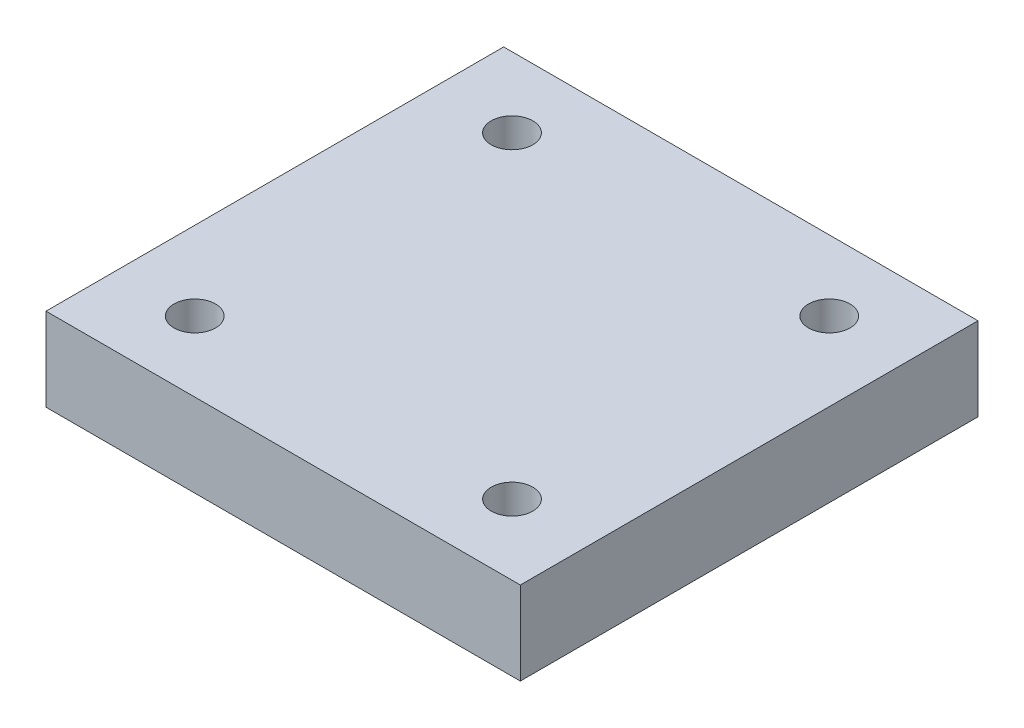
ISO-10303-21;
HEADER;
FILE_DESCRIPTION(('STEP AP214'),'2;1');
FILE_NAME('part.step','',(''),(''),'','','');
FILE_SCHEMA(('AUTOMOTIVE_DESIGN { 1 0 10303 214 1 1 1 1 }'));
ENDSEC;
DATA;
#1=APPLICATION_CONTEXT('core data for automotive mechanical design processes');
#2=APPLICATION_PROTOCOL_DEFINITION('international standard','automotive_design',2000,#1);
#3=PRODUCT_CONTEXT('',#1,'mechanical');
#4=PRODUCT('Part','Part','',(#3));
#5=PRODUCT_RELATED_PRODUCT_CATEGORY('part','',(#4));
#6=PRODUCT_DEFINITION_FORMATION('','',#4);
#7=PRODUCT_DEFINITION_CONTEXT('part definition',#1,'design');
#8=PRODUCT_DEFINITION('design','',#6,#7);
#9=PRODUCT_DEFINITION_SHAPE('','',#8);
#10=(LENGTH_UNIT() NAMED_UNIT(*) SI_UNIT(.MILLI.,.METRE.));
#11=(NAMED_UNIT(*) PLANE_ANGLE_UNIT() SI_UNIT($,.RADIAN.));
#12=(NAMED_UNIT(*) SI_UNIT($,.STERADIAN.) SOLID_ANGLE_UNIT());
#13=UNCERTAINTY_MEASURE_WITH_UNIT(LENGTH_MEASURE(1.E-05),#10,'distance_accuracy_value','');
#14=(GEOMETRIC_REPRESENTATION_CONTEXT(3) GLOBAL_UNCERTAINTY_ASSIGNED_CONTEXT((#13)) GLOBAL_UNIT_ASSIGNED_CONTEXT((#10,
#11,#12)) REPRESENTATION_CONTEXT('',''));
#15=CARTESIAN_POINT('',(0.,0.,0.));
#16=DIRECTION('',(0.,0.,1.));
#17=DIRECTION('',(1.,0.,0.));
#18=AXIS2_PLACEMENT_3D('',#15,#16,#17);
#19=CARTESIAN_POINT('',(0.,8.,0.));
#20=DIRECTION('',(0.,1.,0.));
#21=DIRECTION('',(0.,0.,1.));
#22=AXIS2_PLACEMENT_3D('',#19,#20,#21);
#23=PLANE('',#22);
#24=CARTESIAN_POINT('',(-15.25,8.,-15.25));
#25=DIRECTION('',(0.,1.,0.));
#26=DIRECTION('',(0.,0.,1.));
#27=AXIS2_PLACEMENT_3D('',#24,#25,#26);
#28=CIRCLE('',#27,2.);
#29=CARTESIAN_POINT('',(-15.25,8.,-13.25));
#30=VERTEX_POINT('',#29);
#31=EDGE_CURVE('E131',#30,#30,#28,.T.);
#32=ORIENTED_EDGE('',*,*,#31,.F.);
#33=EDGE_LOOP('',(#32));
#34=FACE_BOUND('',#33,.T.);
#35=CARTESIAN_POINT('',(15.25,8.,-15.25));
#36=DIRECTION('',(0.,1.,0.));
#37=DIRECTION('',(0.,0.,1.));
#38=AXIS2_PLACEMENT_3D('',#35,#36,#37);
#39=CIRCLE('',#38,2.);
#40=CARTESIAN_POINT('',(15.25,8.,-13.25));
#41=VERTEX_POINT('',#40);
#42=EDGE_CURVE('E110',#41,#41,#39,.T.);
#43=ORIENTED_EDGE('',*,*,#42,.F.);
#44=EDGE_LOOP('',(#43));
#45=FACE_BOUND('',#44,.T.);
#46=DIRECTION('',(0.,0.,-1.));
#47=VECTOR('',#46,1.);
#48=CARTESIAN_POINT('',(22.8,8.,-22.));
#49=LINE('',#48,#47);
#50=CARTESIAN_POINT('',(22.8,8.,22.));
#51=VERTEX_POINT('',#50);
#52=CARTESIAN_POINT('',(22.8,8.,-22.));
#53=VERTEX_POINT('',#52);
#54=EDGE_CURVE('E94',#51,#53,#49,.T.);
#55=ORIENTED_EDGE('',*,*,#54,.T.);
#56=DIRECTION('',(-1.,0.,0.));
#57=VECTOR('',#56,1.);
#58=CARTESIAN_POINT('',(-22.8,8.,-22.));
#59=LINE('',#58,#57);
#60=CARTESIAN_POINT('',(-22.8,8.,-22.));
#61=VERTEX_POINT('',#60);
#62=EDGE_CURVE('E89',#53,#61,#59,.T.);
#63=ORIENTED_EDGE('',*,*,#62,.T.);
#64=DIRECTION('',(0.,0.,1.));
#65=VECTOR('',#64,1.);
#66=CARTESIAN_POINT('',(-22.8,8.,-22.));
#67=LINE('',#66,#65);
#68=CARTESIAN_POINT('',(-22.8,8.,22.));
#69=VERTEX_POINT('',#68);
#70=EDGE_CURVE('E93',#61,#69,#67,.T.);
#71=ORIENTED_EDGE('',*,*,#70,.T.);
#72=DIRECTION('',(1.,0.,0.));
#73=VECTOR('',#72,1.);
#74=CARTESIAN_POINT('',(-22.8,8.,22.));
#75=LINE('',#74,#73);
#76=EDGE_CURVE('E58',#69,#51,#75,.T.);
#77=ORIENTED_EDGE('',*,*,#76,.T.);
#78=EDGE_LOOP('',(#55,#63,#71,#77));
#79=FACE_BOUND('',#78,.T.);
#80=CARTESIAN_POINT('',(-15.25,8.,15.25));
#81=DIRECTION('',(0.,1.,0.));
#82=DIRECTION('',(0.,0.,1.));
#83=AXIS2_PLACEMENT_3D('',#80,#81,#82);
#84=CIRCLE('',#83,2.);
#85=CARTESIAN_POINT('',(-15.25,8.,17.25));
#86=VERTEX_POINT('',#85);
#87=EDGE_CURVE('E124',#86,#86,#84,.T.);
#88=ORIENTED_EDGE('',*,*,#87,.F.);
#89=EDGE_LOOP('',(#88));
#90=FACE_BOUND('',#89,.T.);
#91=CARTESIAN_POINT('',(15.25,8.,15.25));
#92=DIRECTION('',(0.,1.,0.));
#93=DIRECTION('',(0.,0.,1.));
#94=AXIS2_PLACEMENT_3D('',#91,#92,#93);
#95=CIRCLE('',#94,2.);
#96=CARTESIAN_POINT('',(15.25,8.,17.25));
#97=VERTEX_POINT('',#96);
#98=EDGE_CURVE('E140',#97,#97,#95,.T.);
#99=ORIENTED_EDGE('',*,*,#98,.F.);
#100=EDGE_LOOP('',(#99));
#101=FACE_BOUND('',#100,.T.);
#102=ADVANCED_FACE('F43',(#34,#45,#79,#90,#101),#23,.T.);
#103=CARTESIAN_POINT('',(0.,0.,0.));
#104=DIRECTION('',(0.,1.,0.));
#105=DIRECTION('',(0.,0.,1.));
#106=AXIS2_PLACEMENT_3D('',#103,#104,#105);
#107=PLANE('',#106);
#108=DIRECTION('',(0.,0.,-1.));
#109=VECTOR('',#108,1.);
#110=CARTESIAN_POINT('',(22.8,0.,-22.));
#111=LINE('',#110,#109);
#112=CARTESIAN_POINT('',(22.8,0.,22.));
#113=VERTEX_POINT('',#112);
#114=CARTESIAN_POINT('',(22.8,0.,-22.));
#115=VERTEX_POINT('',#114);
#116=EDGE_CURVE('E107',#113,#115,#111,.T.);
#117=ORIENTED_EDGE('',*,*,#116,.F.);
#118=DIRECTION('',(1.,0.,0.));
#119=VECTOR('',#118,1.);
#120=CARTESIAN_POINT('',(-22.8,0.,22.));
#121=LINE('',#120,#119);
#122=CARTESIAN_POINT('',(-22.8,0.,22.));
#123=VERTEX_POINT('',#122);
#124=EDGE_CURVE('E81',#123,#113,#121,.T.);
#125=ORIENTED_EDGE('',*,*,#124,.F.);
#126=DIRECTION('',(0.,0.,1.));
#127=VECTOR('',#126,1.);
#128=CARTESIAN_POINT('',(-22.8,0.,-22.));
#129=LINE('',#128,#127);
#130=CARTESIAN_POINT('',(-22.8,0.,-22.));
#131=VERTEX_POINT('',#130);
#132=EDGE_CURVE('E77',#131,#123,#129,.T.);
#133=ORIENTED_EDGE('',*,*,#132,.F.);
#134=DIRECTION('',(-1.,0.,0.));
#135=VECTOR('',#134,1.);
#136=CARTESIAN_POINT('',(-22.8,0.,-22.));
#137=LINE('',#136,#135);
#138=EDGE_CURVE('E98',#115,#131,#137,.T.);
#139=ORIENTED_EDGE('',*,*,#138,.F.);
#140=EDGE_LOOP('',(#117,#125,#133,#139));
#141=FACE_BOUND('',#140,.T.);
#142=CARTESIAN_POINT('',(15.25,0.,-15.25));
#143=DIRECTION('',(0.,1.,0.));
#144=DIRECTION('',(0.,0.,1.));
#145=AXIS2_PLACEMENT_3D('',#142,#143,#144);
#146=CIRCLE('',#145,2.);
#147=CARTESIAN_POINT('',(15.25,0.,-13.25));
#148=VERTEX_POINT('',#147);
#149=EDGE_CURVE('E122',#148,#148,#146,.T.);
#150=ORIENTED_EDGE('',*,*,#149,.T.);
#151=EDGE_LOOP('',(#150));
#152=FACE_BOUND('',#151,.T.);
#153=CARTESIAN_POINT('',(-15.25,0.,15.25));
#154=DIRECTION('',(0.,1.,0.));
#155=DIRECTION('',(0.,0.,1.));
#156=AXIS2_PLACEMENT_3D('',#153,#154,#155);
#157=CIRCLE('',#156,2.);
#158=CARTESIAN_POINT('',(-15.25,0.,17.25));
#159=VERTEX_POINT('',#158);
#160=EDGE_CURVE('E126',#159,#159,#157,.T.);
#161=ORIENTED_EDGE('',*,*,#160,.T.);
#162=EDGE_LOOP('',(#161));
#163=FACE_BOUND('',#162,.T.);
#164=CARTESIAN_POINT('',(-15.25,0.,-15.25));
#165=DIRECTION('',(0.,1.,0.));
#166=DIRECTION('',(0.,0.,1.));
#167=AXIS2_PLACEMENT_3D('',#164,#165,#166);
#168=CIRCLE('',#167,2.);
#169=CARTESIAN_POINT('',(-15.25,0.,-13.25));
#170=VERTEX_POINT('',#169);
#171=EDGE_CURVE('E132',#170,#170,#168,.T.);
#172=ORIENTED_EDGE('',*,*,#171,.T.);
#173=EDGE_LOOP('',(#172));
#174=FACE_BOUND('',#173,.T.);
#175=CARTESIAN_POINT('',(15.25,0.,15.25));
#176=DIRECTION('',(0.,1.,0.));
#177=DIRECTION('',(0.,0.,1.));
#178=AXIS2_PLACEMENT_3D('',#175,#176,#177);
#179=CIRCLE('',#178,2.);
#180=CARTESIAN_POINT('',(15.25,0.,17.25));
#181=VERTEX_POINT('',#180);
#182=EDGE_CURVE('E139',#181,#181,#179,.T.);
#183=ORIENTED_EDGE('',*,*,#182,.T.);
#184=EDGE_LOOP('',(#183));
#185=FACE_BOUND('',#184,.T.);
#186=ADVANCED_FACE('F119',(#141,#152,#163,#174,#185),#107,.F.);
#187=CARTESIAN_POINT('',(22.8,8.,-22.));
#188=DIRECTION('',(-1.,0.,0.));
#189=DIRECTION('',(0.,0.,1.));
#190=AXIS2_PLACEMENT_3D('',#187,#188,#189);
#191=PLANE('',#190);
#192=ORIENTED_EDGE('',*,*,#116,.T.);
#193=DIRECTION('',(0.,-1.,0.));
#194=VECTOR('',#193,1.);
#195=CARTESIAN_POINT('',(22.8,8.,-22.));
#196=LINE('',#195,#194);
#197=EDGE_CURVE('E11',#53,#115,#196,.T.);
#198=ORIENTED_EDGE('',*,*,#197,.F.);
#199=ORIENTED_EDGE('',*,*,#54,.F.);
#200=DIRECTION('',(0.,-1.,0.));
#201=VECTOR('',#200,1.);
#202=CARTESIAN_POINT('',(22.8,8.,22.));
#203=LINE('',#202,#201);
#204=EDGE_CURVE('E104',#51,#113,#203,.T.);
#205=ORIENTED_EDGE('',*,*,#204,.T.);
#206=EDGE_LOOP('',(#192,#198,#199,#205));
#207=FACE_BOUND('',#206,.T.);
#208=ADVANCED_FACE('F44',(#207),#191,.F.);
#209=CARTESIAN_POINT('',(-22.8,8.,-22.));
#210=DIRECTION('',(0.,0.,1.));
#211=DIRECTION('',(1.,0.,0.));
#212=AXIS2_PLACEMENT_3D('',#209,#210,#211);
#213=PLANE('',#212);
#214=ORIENTED_EDGE('',*,*,#138,.T.);
#215=DIRECTION('',(0.,-1.,0.));
#216=VECTOR('',#215,1.);
#217=CARTESIAN_POINT('',(-22.8,8.,-22.));
#218=LINE('',#217,#216);
#219=EDGE_CURVE('E55',#61,#131,#218,.T.);
#220=ORIENTED_EDGE('',*,*,#219,.F.);
#221=ORIENTED_EDGE('',*,*,#62,.F.);
#222=ORIENTED_EDGE('',*,*,#197,.T.);
#223=EDGE_LOOP('',(#214,#220,#221,#222));
#224=FACE_BOUND('',#223,.T.);
#225=ADVANCED_FACE('F97',(#224),#213,.F.);
#226=CARTESIAN_POINT('',(-22.8,8.,-22.));
#227=DIRECTION('',(1.,0.,0.));
#228=DIRECTION('',(0.,0.,-1.));
#229=AXIS2_PLACEMENT_3D('',#226,#227,#228);
#230=PLANE('',#229);
#231=ORIENTED_EDGE('',*,*,#132,.T.);
#232=DIRECTION('',(0.,-1.,0.));
#233=VECTOR('',#232,1.);
#234=CARTESIAN_POINT('',(-22.8,8.,22.));
#235=LINE('',#234,#233);
#236=EDGE_CURVE('E99',#69,#123,#235,.T.);
#237=ORIENTED_EDGE('',*,*,#236,.F.);
#238=ORIENTED_EDGE('',*,*,#70,.F.);
#239=ORIENTED_EDGE('',*,*,#219,.T.);
#240=EDGE_LOOP('',(#231,#237,#238,#239));
#241=FACE_BOUND('',#240,.T.);
#242=ADVANCED_FACE('F102',(#241),#230,.F.);
#243=CARTESIAN_POINT('',(-22.8,8.,22.));
#244=DIRECTION('',(0.,0.,-1.));
#245=DIRECTION('',(-1.,0.,0.));
#246=AXIS2_PLACEMENT_3D('',#243,#244,#245);
#247=PLANE('',#246);
#248=ORIENTED_EDGE('',*,*,#124,.T.);
#249=ORIENTED_EDGE('',*,*,#204,.F.);
#250=ORIENTED_EDGE('',*,*,#76,.F.);
#251=ORIENTED_EDGE('',*,*,#236,.T.);
#252=EDGE_LOOP('',(#248,#249,#250,#251));
#253=FACE_BOUND('',#252,.T.);
#254=ADVANCED_FACE('F113',(#253),#247,.F.);
#255=CARTESIAN_POINT('',(15.25,8.,-15.25));
#256=DIRECTION('',(0.,-1.,0.));
#257=DIRECTION('',(0.,0.,-1.));
#258=AXIS2_PLACEMENT_3D('',#255,#256,#257);
#259=CYLINDRICAL_SURFACE('',#258,2.);
#260=ORIENTED_EDGE('',*,*,#42,.T.);
#261=EDGE_LOOP('',(#260));
#262=FACE_BOUND('',#261,.T.);
#263=ORIENTED_EDGE('',*,*,#149,.F.);
#264=EDGE_LOOP('',(#263));
#265=FACE_BOUND('',#264,.T.);
#266=ADVANCED_FACE('F159',(#262,#265),#259,.F.);
#267=CARTESIAN_POINT('',(-15.25,8.,15.25));
#268=DIRECTION('',(0.,-1.,0.));
#269=DIRECTION('',(0.,0.,-1.));
#270=AXIS2_PLACEMENT_3D('',#267,#268,#269);
#271=CYLINDRICAL_SURFACE('',#270,2.);
#272=ORIENTED_EDGE('',*,*,#87,.T.);
#273=EDGE_LOOP('',(#272));
#274=FACE_BOUND('',#273,.T.);
#275=ORIENTED_EDGE('',*,*,#160,.F.);
#276=EDGE_LOOP('',(#275));
#277=FACE_BOUND('',#276,.T.);
#278=ADVANCED_FACE('F204',(#274,#277),#271,.F.);
#279=CARTESIAN_POINT('',(-15.25,8.,-15.25));
#280=DIRECTION('',(0.,-1.,0.));
#281=DIRECTION('',(0.,0.,-1.));
#282=AXIS2_PLACEMENT_3D('',#279,#280,#281);
#283=CYLINDRICAL_SURFACE('',#282,2.);
#284=ORIENTED_EDGE('',*,*,#31,.T.);
#285=EDGE_LOOP('',(#284));
#286=FACE_BOUND('',#285,.T.);
#287=ORIENTED_EDGE('',*,*,#171,.F.);
#288=EDGE_LOOP('',(#287));
#289=FACE_BOUND('',#288,.T.);
#290=ADVANCED_FACE('F212',(#286,#289),#283,.F.);
#291=CARTESIAN_POINT('',(15.25,8.,15.25));
#292=DIRECTION('',(0.,-1.,0.));
#293=DIRECTION('',(0.,0.,-1.));
#294=AXIS2_PLACEMENT_3D('',#291,#292,#293);
#295=CYLINDRICAL_SURFACE('',#294,2.);
#296=ORIENTED_EDGE('',*,*,#98,.T.);
#297=EDGE_LOOP('',(#296));
#298=FACE_BOUND('',#297,.T.);
#299=ORIENTED_EDGE('',*,*,#182,.F.);
#300=EDGE_LOOP('',(#299));
#301=FACE_BOUND('',#300,.T.);
#302=ADVANCED_FACE('F147',(#298,#301),#295,.F.);
#303=CLOSED_SHELL('',(#102,#186,#208,#225,#242,#254,#266,#278,#290,#302));
#304=MANIFOLD_SOLID_BREP('B2',#303);
#305=ADVANCED_BREP_SHAPE_REPRESENTATION('',(#18,#304),#14);
#306=SHAPE_DEFINITION_REPRESENTATION(#9,#305);
ENDSEC;
END-ISO-10303-21;
